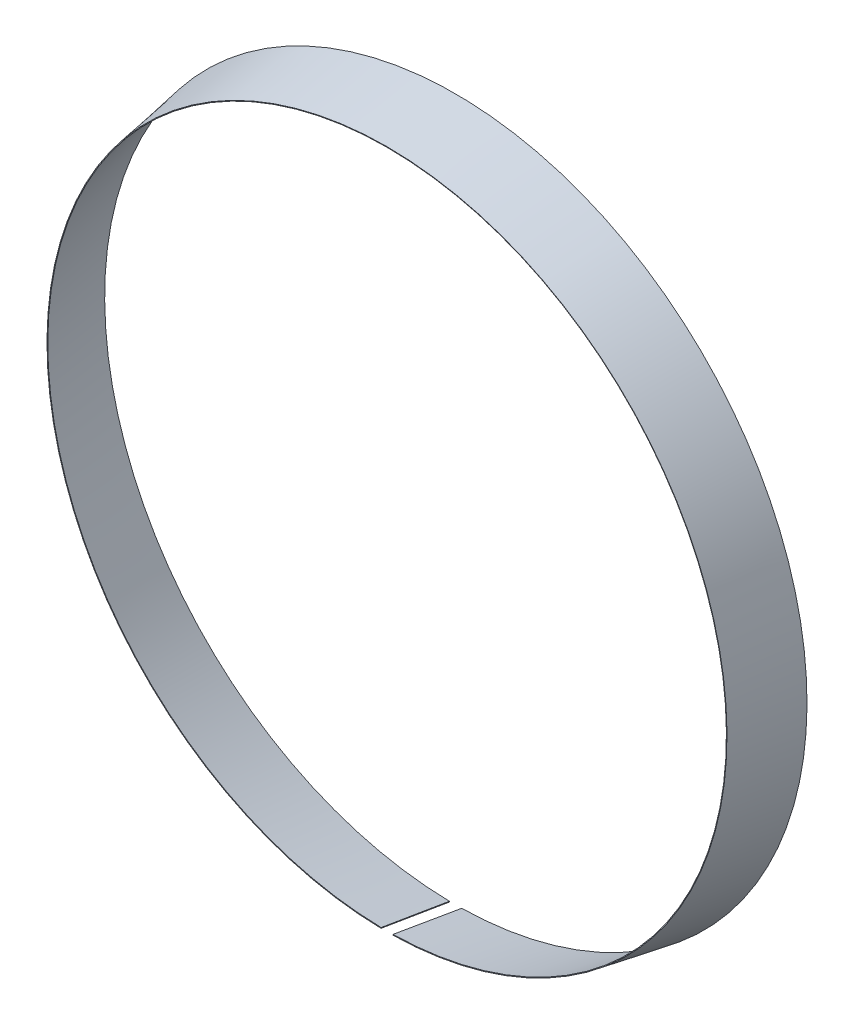
ISO-10303-21;
HEADER;
FILE_DESCRIPTION(('STEP AP214'),'2;1');
FILE_NAME('part.step','',(''),(''),'','','');
FILE_SCHEMA(('AUTOMOTIVE_DESIGN { 1 0 10303 214 1 1 1 1 }'));
ENDSEC;
DATA;
#1=APPLICATION_CONTEXT('core data for automotive mechanical design processes');
#2=APPLICATION_PROTOCOL_DEFINITION('international standard','automotive_design',2000,#1);
#3=PRODUCT_CONTEXT('',#1,'mechanical');
#4=PRODUCT('Part','Part','',(#3));
#5=PRODUCT_RELATED_PRODUCT_CATEGORY('part','',(#4));
#6=PRODUCT_DEFINITION_FORMATION('','',#4);
#7=PRODUCT_DEFINITION_CONTEXT('part definition',#1,'design');
#8=PRODUCT_DEFINITION('design','',#6,#7);
#9=PRODUCT_DEFINITION_SHAPE('','',#8);
#10=(LENGTH_UNIT() NAMED_UNIT(*) SI_UNIT(.MILLI.,.METRE.));
#11=(NAMED_UNIT(*) PLANE_ANGLE_UNIT() SI_UNIT($,.RADIAN.));
#12=(NAMED_UNIT(*) SI_UNIT($,.STERADIAN.) SOLID_ANGLE_UNIT());
#13=UNCERTAINTY_MEASURE_WITH_UNIT(LENGTH_MEASURE(1.E-05),#10,'distance_accuracy_value','');
#14=(GEOMETRIC_REPRESENTATION_CONTEXT(3) GLOBAL_UNCERTAINTY_ASSIGNED_CONTEXT((#13)) GLOBAL_UNIT_ASSIGNED_CONTEXT((#10,
#11,#12)) REPRESENTATION_CONTEXT('',''));
#15=CARTESIAN_POINT('',(0.,0.,0.));
#16=DIRECTION('',(0.,0.,1.));
#17=DIRECTION('',(1.,0.,0.));
#18=AXIS2_PLACEMENT_3D('',#15,#16,#17);
#19=CARTESIAN_POINT('',(0.,0.,1277.6));
#20=DIRECTION('',(0.,0.,-1.));
#21=DIRECTION('',(-1.,0.,0.));
#22=AXIS2_PLACEMENT_3D('',#19,#20,#21);
#23=CONICAL_SURFACE('',#22,49.6637725915059,0.167401509875783);
#24=CARTESIAN_POINT('',(0.,0.,1267.6));
#25=DIRECTION('',(0.,0.,1.));
#26=DIRECTION('',(-1.,0.,0.));
#27=AXIS2_PLACEMENT_3D('',#24,#25,#26);
#28=CIRCLE('',#27,51.3536021057671);
#29=CARTESIAN_POINT('',(0.896243935968551,-51.3457807034297,1267.6));
#30=VERTEX_POINT('',#29);
#31=CARTESIAN_POINT('',(-0.896243935968488,-51.3457807034297,1267.6));
#32=VERTEX_POINT('',#31);
#33=EDGE_CURVE('E10',#30,#32,#28,.T.);
#34=ORIENTED_EDGE('',*,*,#33,.T.);
#35=DIRECTION('',(-0.00290793302359558,-0.166595371346584,-0.986021057671399));
#36=VECTOR('',#35,1.);
#37=CARTESIAN_POINT('',(-0.866752344475878,-49.6562085583883,1277.6));
#38=LINE('',#37,#36);
#39=CARTESIAN_POINT('',(-0.866752344475878,-49.6562085583883,1277.6));
#40=VERTEX_POINT('',#39);
#41=EDGE_CURVE('E35',#40,#32,#38,.T.);
#42=ORIENTED_EDGE('',*,*,#41,.F.);
#43=CARTESIAN_POINT('',(0.,0.,1277.6));
#44=DIRECTION('',(0.,0.,1.));
#45=DIRECTION('',(-1.,0.,0.));
#46=AXIS2_PLACEMENT_3D('',#43,#44,#45);
#47=CIRCLE('',#46,49.6637725915059);
#48=CARTESIAN_POINT('',(0.866752344475942,-49.6562085583883,1277.6));
#49=VERTEX_POINT('',#48);
#50=EDGE_CURVE('E72',#49,#40,#47,.T.);
#51=ORIENTED_EDGE('',*,*,#50,.F.);
#52=DIRECTION('',(0.00290793302359558,-0.166595371346584,-0.986021057671399));
#53=VECTOR('',#52,1.);
#54=CARTESIAN_POINT('',(0.866752344475942,-49.6562085583883,1277.6));
#55=LINE('',#54,#53);
#56=EDGE_CURVE('E26',#49,#30,#55,.T.);
#57=ORIENTED_EDGE('',*,*,#56,.T.);
#58=EDGE_LOOP('',(#34,#42,#51,#57));
#59=FACE_BOUND('',#58,.T.);
#60=ADVANCED_FACE('F16',(#59),#23,.T.);
#61=CARTESIAN_POINT('',(0.,0.,1267.6));
#62=DIRECTION('',(0.,0.,1.));
#63=DIRECTION('',(1.,0.,0.));
#64=AXIS2_PLACEMENT_3D('',#61,#62,#63);
#65=CONICAL_SURFACE('',#64,51.3536021057671,1.4033948169191);
#66=CARTESIAN_POINT('',(0.,0.,1267.58333792515));
#67=DIRECTION('',(0.,0.,1.));
#68=DIRECTION('',(-1.,0.,0.));
#69=AXIS2_PLACEMENT_3D('',#66,#67,#68);
#70=CIRCLE('',#69,51.255);
#71=CARTESIAN_POINT('',(0.894523091943131,-51.2471936152408,1267.58333792515));
#72=VERTEX_POINT('',#71);
#73=CARTESIAN_POINT('',(-0.894523091943067,-51.2471936152408,1267.58333792515));
#74=VERTEX_POINT('',#73);
#75=EDGE_CURVE('E81',#72,#74,#70,.T.);
#76=ORIENTED_EDGE('',*,*,#75,.T.);
#77=DIRECTION('',(0.0172084402542039,0.985870881888412,-0.166620748493642));
#78=VECTOR('',#77,1.);
#79=CARTESIAN_POINT('',(-0.896243935968488,-51.3457807034297,1267.6));
#80=LINE('',#79,#78);
#81=EDGE_CURVE('E60',#32,#74,#80,.T.);
#82=ORIENTED_EDGE('',*,*,#81,.F.);
#83=ORIENTED_EDGE('',*,*,#33,.F.);
#84=DIRECTION('',(-0.0172084402542039,0.985870881888412,-0.166620748493642));
#85=VECTOR('',#84,1.);
#86=CARTESIAN_POINT('',(0.896243935968551,-51.3457807034297,1267.6));
#87=LINE('',#86,#85);
#88=EDGE_CURVE('E68',#30,#72,#87,.T.);
#89=ORIENTED_EDGE('',*,*,#88,.T.);
#90=EDGE_LOOP('',(#76,#82,#83,#89));
#91=FACE_BOUND('',#90,.T.);
#92=ADVANCED_FACE('F88',(#91),#65,.T.);
#93=CARTESIAN_POINT('',(0.,0.,1267.58333792515));
#94=DIRECTION('',(0.,0.,-1.));
#95=DIRECTION('',(-1.,0.,0.));
#96=AXIS2_PLACEMENT_3D('',#93,#94,#95);
#97=CONICAL_SURFACE('',#96,51.255,0.167401509875784);
#98=CARTESIAN_POINT('',(0.,0.,1277.58333792515));
#99=DIRECTION('',(0.,0.,1.));
#100=DIRECTION('',(-1.,0.,0.));
#101=AXIS2_PLACEMENT_3D('',#98,#99,#100);
#102=CIRCLE('',#101,49.5651704857387);
#103=CARTESIAN_POINT('',(0.865031500450521,-49.5576214701994,1277.58333792515));
#104=VERTEX_POINT('',#103);
#105=CARTESIAN_POINT('',(-0.865031500450457,-49.5576214701994,1277.58333792515));
#106=VERTEX_POINT('',#105);
#107=EDGE_CURVE('E63',#104,#106,#102,.T.);
#108=ORIENTED_EDGE('',*,*,#107,.T.);
#109=DIRECTION('',(0.00290793302359559,0.166595371346585,0.986021057671399));
#110=VECTOR('',#109,1.);
#111=CARTESIAN_POINT('',(-0.894523091943067,-51.2471936152408,1267.58333792515));
#112=LINE('',#111,#110);
#113=EDGE_CURVE('E57',#74,#106,#112,.T.);
#114=ORIENTED_EDGE('',*,*,#113,.F.);
#115=ORIENTED_EDGE('',*,*,#75,.F.);
#116=DIRECTION('',(-0.00290793302359559,0.166595371346585,0.986021057671399));
#117=VECTOR('',#116,1.);
#118=CARTESIAN_POINT('',(0.894523091943131,-51.2471936152408,1267.58333792515));
#119=LINE('',#118,#117);
#120=EDGE_CURVE('E53',#72,#104,#119,.T.);
#121=ORIENTED_EDGE('',*,*,#120,.T.);
#122=EDGE_LOOP('',(#108,#114,#115,#121));
#123=FACE_BOUND('',#122,.T.);
#124=ADVANCED_FACE('F64',(#123),#97,.F.);
#125=CARTESIAN_POINT('',(0.,0.,1277.58333792515));
#126=DIRECTION('',(0.,0.,1.));
#127=DIRECTION('',(1.,0.,0.));
#128=AXIS2_PLACEMENT_3D('',#125,#126,#127);
#129=CONICAL_SURFACE('',#128,49.5651704857387,1.40339481691906);
#130=DIRECTION('',(0.0172084402542039,-0.985870881888411,0.166620748493649));
#131=VECTOR('',#130,1.);
#132=CARTESIAN_POINT('',(0.865031500450521,-49.5576214701994,1277.58333792515));
#133=LINE('',#132,#131);
#134=EDGE_CURVE('E73',#104,#49,#133,.T.);
#135=ORIENTED_EDGE('',*,*,#134,.T.);
#136=ORIENTED_EDGE('',*,*,#50,.T.);
#137=DIRECTION('',(-0.0172084402542039,-0.985870881888411,0.166620748493649));
#138=VECTOR('',#137,1.);
#139=CARTESIAN_POINT('',(-0.865031500450457,-49.5576214701994,1277.58333792515));
#140=LINE('',#139,#138);
#141=EDGE_CURVE('E20',#106,#40,#140,.T.);
#142=ORIENTED_EDGE('',*,*,#141,.F.);
#143=ORIENTED_EDGE('',*,*,#107,.F.);
#144=EDGE_LOOP('',(#135,#136,#142,#143));
#145=FACE_BOUND('',#144,.T.);
#146=ADVANCED_FACE('F71',(#145),#129,.F.);
#147=CARTESIAN_POINT('',(0.896243935968551,-51.3457807034297,1267.6));
#148=DIRECTION('',(0.999847695156391,0.0174524064372861,0.));
#149=DIRECTION('',(0.0174524064372861,-0.999847695156391,0.));
#150=AXIS2_PLACEMENT_3D('',#147,#148,#149);
#151=PLANE('',#150);
#152=ORIENTED_EDGE('',*,*,#56,.F.);
#153=ORIENTED_EDGE('',*,*,#134,.F.);
#154=ORIENTED_EDGE('',*,*,#120,.F.);
#155=ORIENTED_EDGE('',*,*,#88,.F.);
#156=EDGE_LOOP('',(#152,#153,#154,#155));
#157=FACE_BOUND('',#156,.T.);
#158=ADVANCED_FACE('F90',(#157),#151,.F.);
#159=CARTESIAN_POINT('',(-0.896243935968488,-51.3457807034297,1267.6));
#160=DIRECTION('',(0.999847695156391,-0.0174524064372861,0.));
#161=DIRECTION('',(-0.0174524064372861,-0.999847695156391,0.));
#162=AXIS2_PLACEMENT_3D('',#159,#160,#161);
#163=PLANE('',#162);
#164=ORIENTED_EDGE('',*,*,#41,.T.);
#165=ORIENTED_EDGE('',*,*,#81,.T.);
#166=ORIENTED_EDGE('',*,*,#113,.T.);
#167=ORIENTED_EDGE('',*,*,#141,.T.);
#168=EDGE_LOOP('',(#164,#165,#166,#167));
#169=FACE_BOUND('',#168,.T.);
#170=ADVANCED_FACE('F18',(#169),#163,.T.);
#171=CLOSED_SHELL('',(#60,#92,#124,#146,#158,#170));
#172=MANIFOLD_SOLID_BREP('B1',#171);
#173=ADVANCED_BREP_SHAPE_REPRESENTATION('',(#18,#172),#14);
#174=SHAPE_DEFINITION_REPRESENTATION(#9,#173);
ENDSEC;
END-ISO-10303-21;
